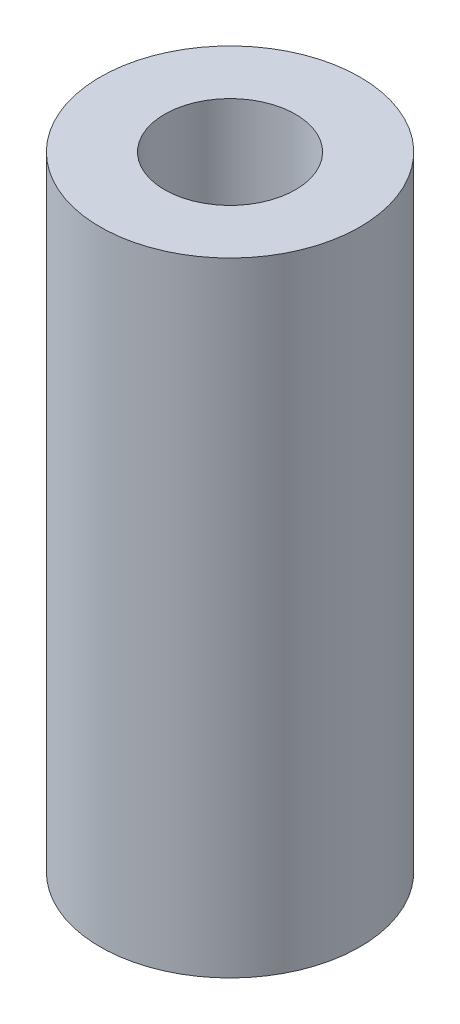
ISO-10303-21;
HEADER;
FILE_DESCRIPTION(('STEP AP214'),'2;1');
FILE_NAME('part.step','',(''),(''),'','','');
FILE_SCHEMA(('AUTOMOTIVE_DESIGN { 1 0 10303 214 1 1 1 1 }'));
ENDSEC;
DATA;
#1=APPLICATION_CONTEXT('core data for automotive mechanical design processes');
#2=APPLICATION_PROTOCOL_DEFINITION('international standard','automotive_design',2000,#1);
#3=PRODUCT_CONTEXT('',#1,'mechanical');
#4=PRODUCT('Part','Part','',(#3));
#5=PRODUCT_RELATED_PRODUCT_CATEGORY('part','',(#4));
#6=PRODUCT_DEFINITION_FORMATION('','',#4);
#7=PRODUCT_DEFINITION_CONTEXT('part definition',#1,'design');
#8=PRODUCT_DEFINITION('design','',#6,#7);
#9=PRODUCT_DEFINITION_SHAPE('','',#8);
#10=(LENGTH_UNIT() NAMED_UNIT(*) SI_UNIT(.MILLI.,.METRE.));
#11=(NAMED_UNIT(*) PLANE_ANGLE_UNIT() SI_UNIT($,.RADIAN.));
#12=(NAMED_UNIT(*) SI_UNIT($,.STERADIAN.) SOLID_ANGLE_UNIT());
#13=UNCERTAINTY_MEASURE_WITH_UNIT(LENGTH_MEASURE(1.E-05),#10,'distance_accuracy_value','');
#14=(GEOMETRIC_REPRESENTATION_CONTEXT(3) GLOBAL_UNCERTAINTY_ASSIGNED_CONTEXT((#13)) GLOBAL_UNIT_ASSIGNED_CONTEXT((#10,
#11,#12)) REPRESENTATION_CONTEXT('',''));
#15=CARTESIAN_POINT('',(0.,0.,0.));
#16=DIRECTION('',(0.,0.,1.));
#17=DIRECTION('',(1.,0.,0.));
#18=AXIS2_PLACEMENT_3D('',#15,#16,#17);
#19=CARTESIAN_POINT('',(0.,38.1,0.));
#20=DIRECTION('',(0.,-1.,0.));
#21=DIRECTION('',(0.,0.,-1.));
#22=AXIS2_PLACEMENT_3D('',#19,#20,#21);
#23=CYLINDRICAL_SURFACE('',#22,15.875);
#24=CARTESIAN_POINT('',(0.,38.1,0.));
#25=DIRECTION('',(0.,1.,0.));
#26=DIRECTION('',(0.,0.,1.));
#27=AXIS2_PLACEMENT_3D('',#24,#25,#26);
#28=CIRCLE('',#27,15.875);
#29=CARTESIAN_POINT('',(0.,38.1,-15.875));
#30=VERTEX_POINT('',#29);
#31=EDGE_CURVE('E10',#30,#30,#28,.T.);
#32=CARTESIAN_POINT('',(0.,-38.1,0.));
#33=DIRECTION('',(0.,1.,0.));
#34=DIRECTION('',(0.,0.,1.));
#35=AXIS2_PLACEMENT_3D('',#32,#33,#34);
#36=CIRCLE('',#35,15.875);
#37=CARTESIAN_POINT('',(0.,-38.1,-15.875));
#38=VERTEX_POINT('',#37);
#39=EDGE_CURVE('E40',#38,#38,#36,.T.);
#40=CARTESIAN_POINT('',(0.,38.1,-15.875));
#41=CARTESIAN_POINT('',(0.,37.30625,-15.875));
#42=CARTESIAN_POINT('',(0.,36.5125,-15.875));
#43=CARTESIAN_POINT('',(0.,34.925,-15.875));
#44=CARTESIAN_POINT('',(0.,34.13125,-15.875));
#45=CARTESIAN_POINT('',(0.,32.54375,-15.875));
#46=CARTESIAN_POINT('',(0.,31.75,-15.875));
#47=CARTESIAN_POINT('',(0.,30.1625,-15.875));
#48=CARTESIAN_POINT('',(0.,29.36875,-15.875));
#49=CARTESIAN_POINT('',(0.,27.78125,-15.875));
#50=CARTESIAN_POINT('',(0.,26.9875,-15.875));
#51=CARTESIAN_POINT('',(0.,25.4,-15.875));
#52=CARTESIAN_POINT('',(0.,24.60625,-15.875));
#53=CARTESIAN_POINT('',(0.,23.01875,-15.875));
#54=CARTESIAN_POINT('',(0.,22.225,-15.875));
#55=CARTESIAN_POINT('',(0.,20.6375,-15.875));
#56=CARTESIAN_POINT('',(0.,19.84375,-15.875));
#57=CARTESIAN_POINT('',(0.,18.25625,-15.875));
#58=CARTESIAN_POINT('',(0.,17.4625,-15.875));
#59=CARTESIAN_POINT('',(0.,15.875,-15.875));
#60=CARTESIAN_POINT('',(0.,15.08125,-15.875));
#61=CARTESIAN_POINT('',(0.,13.49375,-15.875));
#62=CARTESIAN_POINT('',(0.,12.7,-15.875));
#63=CARTESIAN_POINT('',(0.,11.1125,-15.875));
#64=CARTESIAN_POINT('',(0.,10.31875,-15.875));
#65=CARTESIAN_POINT('',(0.,8.73124999999999,-15.875));
#66=CARTESIAN_POINT('',(0.,7.93749999999999,-15.875));
#67=CARTESIAN_POINT('',(0.,6.35,-15.875));
#68=CARTESIAN_POINT('',(0.,5.55625,-15.875));
#69=CARTESIAN_POINT('',(0.,3.96875,-15.875));
#70=CARTESIAN_POINT('',(0.,3.175,-15.875));
#71=CARTESIAN_POINT('',(0.,1.5875,-15.875));
#72=CARTESIAN_POINT('',(0.,0.793750000000001,-15.875));
#73=CARTESIAN_POINT('',(0.,-0.793750000000001,-15.875));
#74=CARTESIAN_POINT('',(0.,-1.5875,-15.875));
#75=CARTESIAN_POINT('',(0.,-3.175,-15.875));
#76=CARTESIAN_POINT('',(0.,-3.96875,-15.875));
#77=CARTESIAN_POINT('',(0.,-5.55625,-15.875));
#78=CARTESIAN_POINT('',(0.,-6.35,-15.875));
#79=CARTESIAN_POINT('',(0.,-7.93750000000001,-15.875));
#80=CARTESIAN_POINT('',(0.,-8.73125,-15.875));
#81=CARTESIAN_POINT('',(0.,-10.31875,-15.875));
#82=CARTESIAN_POINT('',(0.,-11.1125,-15.875));
#83=CARTESIAN_POINT('',(0.,-12.7,-15.875));
#84=CARTESIAN_POINT('',(0.,-13.49375,-15.875));
#85=CARTESIAN_POINT('',(0.,-15.08125,-15.875));
#86=CARTESIAN_POINT('',(0.,-15.875,-15.875));
#87=CARTESIAN_POINT('',(0.,-17.4625,-15.875));
#88=CARTESIAN_POINT('',(0.,-18.25625,-15.875));
#89=CARTESIAN_POINT('',(0.,-19.84375,-15.875));
#90=CARTESIAN_POINT('',(0.,-20.6375,-15.875));
#91=CARTESIAN_POINT('',(0.,-22.225,-15.875));
#92=CARTESIAN_POINT('',(0.,-23.01875,-15.875));
#93=CARTESIAN_POINT('',(0.,-24.60625,-15.875));
#94=CARTESIAN_POINT('',(0.,-25.4,-15.875));
#95=CARTESIAN_POINT('',(0.,-26.9875,-15.875));
#96=CARTESIAN_POINT('',(0.,-27.78125,-15.875));
#97=CARTESIAN_POINT('',(0.,-29.36875,-15.875));
#98=CARTESIAN_POINT('',(0.,-30.1625,-15.875));
#99=CARTESIAN_POINT('',(0.,-31.75,-15.875));
#100=CARTESIAN_POINT('',(0.,-32.54375,-15.875));
#101=CARTESIAN_POINT('',(0.,-34.13125,-15.875));
#102=CARTESIAN_POINT('',(0.,-34.925,-15.875));
#103=CARTESIAN_POINT('',(0.,-36.5125,-15.875));
#104=CARTESIAN_POINT('',(0.,-37.30625,-15.875));
#105=CARTESIAN_POINT('',(0.,-38.1,-15.875));
#106=B_SPLINE_CURVE_WITH_KNOTS('',3,(#40,#41,#42,#43,#44,#45,#46,#47,#48,#49,#50,#51,#52,#53,
#54,#55,#56,#57,#58,#59,#60,#61,#62,#63,#64,#65,#66,#67,#68,#69,#70,#71,#72,#73,#74,#75,#76,#77,
#78,#79,#80,#81,#82,#83,#84,#85,#86,#87,#88,#89,#90,#91,#92,#93,#94,#95,#96,#97,#98,#99,#100,
#101,#102,#103,#104,#105),.UNSPECIFIED.,.F.,.F.,(4,2,2,2,2,2,2,2,2,2,2,2,2,2,2,2,2,2,2,2,2,2,2,
2,2,2,2,2,2,2,2,2,4),(0.,2.38125,4.7625,7.14375,9.52500000000001,11.90625,14.2875,16.66875,
19.05,21.43125,23.8125,26.19375,28.575,30.95625,33.3375,35.71875,38.1,40.48125,42.8625,45.24375,
47.625,50.00625,52.3875,54.76875,57.15,59.53125,61.9125,64.29375,66.675,69.05625,71.4375,
73.81875,76.2),.UNSPECIFIED.);
#107=EDGE_CURVE('BSEAM37',#30,#38,#106,.T.);
#108=ORIENTED_EDGE('',*,*,#31,.F.);
#109=ORIENTED_EDGE('',*,*,#39,.T.);
#110=ORIENTED_EDGE('',*,*,#107,.T.);
#111=ORIENTED_EDGE('',*,*,#107,.F.);
#112=EDGE_LOOP('',(#108,#110,#109,#111));
#113=FACE_BOUND('',#112,.T.);
#114=ADVANCED_FACE('F37',(#113),#23,.T.);
#115=CARTESIAN_POINT('',(0.,38.1,0.));
#116=DIRECTION('',(0.,1.,0.));
#117=DIRECTION('',(0.,0.,1.));
#118=AXIS2_PLACEMENT_3D('',#115,#116,#117);
#119=PLANE('',#118);
#120=CARTESIAN_POINT('',(0.,38.1,0.));
#121=DIRECTION('',(0.,1.,0.));
#122=DIRECTION('',(0.,0.,1.));
#123=AXIS2_PLACEMENT_3D('',#120,#121,#122);
#124=CIRCLE('',#123,8.00100000000001);
#125=CARTESIAN_POINT('',(0.,38.1,8.00100000000001));
#126=VERTEX_POINT('',#125);
#127=EDGE_CURVE('E51',#126,#126,#124,.T.);
#128=ORIENTED_EDGE('',*,*,#127,.F.);
#129=EDGE_LOOP('',(#128));
#130=FACE_BOUND('',#129,.T.);
#131=ORIENTED_EDGE('',*,*,#31,.T.);
#132=EDGE_LOOP('',(#131));
#133=FACE_BOUND('',#132,.T.);
#134=ADVANCED_FACE('F57',(#130,#133),#119,.T.);
#135=CARTESIAN_POINT('',(0.,-38.1,0.));
#136=DIRECTION('',(0.,1.,0.));
#137=DIRECTION('',(0.,0.,1.));
#138=AXIS2_PLACEMENT_3D('',#135,#136,#137);
#139=PLANE('',#138);
#140=CARTESIAN_POINT('',(0.,-38.1,0.));
#141=DIRECTION('',(0.,1.,0.));
#142=DIRECTION('',(0.,0.,1.));
#143=AXIS2_PLACEMENT_3D('',#140,#141,#142);
#144=CIRCLE('',#143,8.001);
#145=CARTESIAN_POINT('',(0.,-38.1,8.001));
#146=VERTEX_POINT('',#145);
#147=EDGE_CURVE('E47',#146,#146,#144,.T.);
#148=ORIENTED_EDGE('',*,*,#147,.T.);
#149=EDGE_LOOP('',(#148));
#150=FACE_BOUND('',#149,.T.);
#151=ORIENTED_EDGE('',*,*,#39,.F.);
#152=EDGE_LOOP('',(#151));
#153=FACE_BOUND('',#152,.T.);
#154=ADVANCED_FACE('F59',(#150,#153),#139,.F.);
#155=CARTESIAN_POINT('',(0.,38.1,0.));
#156=DIRECTION('',(0.,1.,0.));
#157=DIRECTION('',(0.,0.,1.));
#158=AXIS2_PLACEMENT_3D('',#155,#156,#157);
#159=CYLINDRICAL_SURFACE('',#158,8.00100000000001);
#160=ORIENTED_EDGE('',*,*,#147,.F.);
#161=EDGE_LOOP('',(#160));
#162=FACE_BOUND('',#161,.T.);
#163=ORIENTED_EDGE('',*,*,#127,.T.);
#164=EDGE_LOOP('',(#163));
#165=FACE_BOUND('',#164,.T.);
#166=ADVANCED_FACE('F55',(#162,#165),#159,.F.);
#167=CLOSED_SHELL('',(#114,#134,#154,#166));
#168=MANIFOLD_SOLID_BREP('B2',#167);
#169=ADVANCED_BREP_SHAPE_REPRESENTATION('',(#18,#168),#14);
#170=SHAPE_DEFINITION_REPRESENTATION(#9,#169);
ENDSEC;
END-ISO-10303-21;
